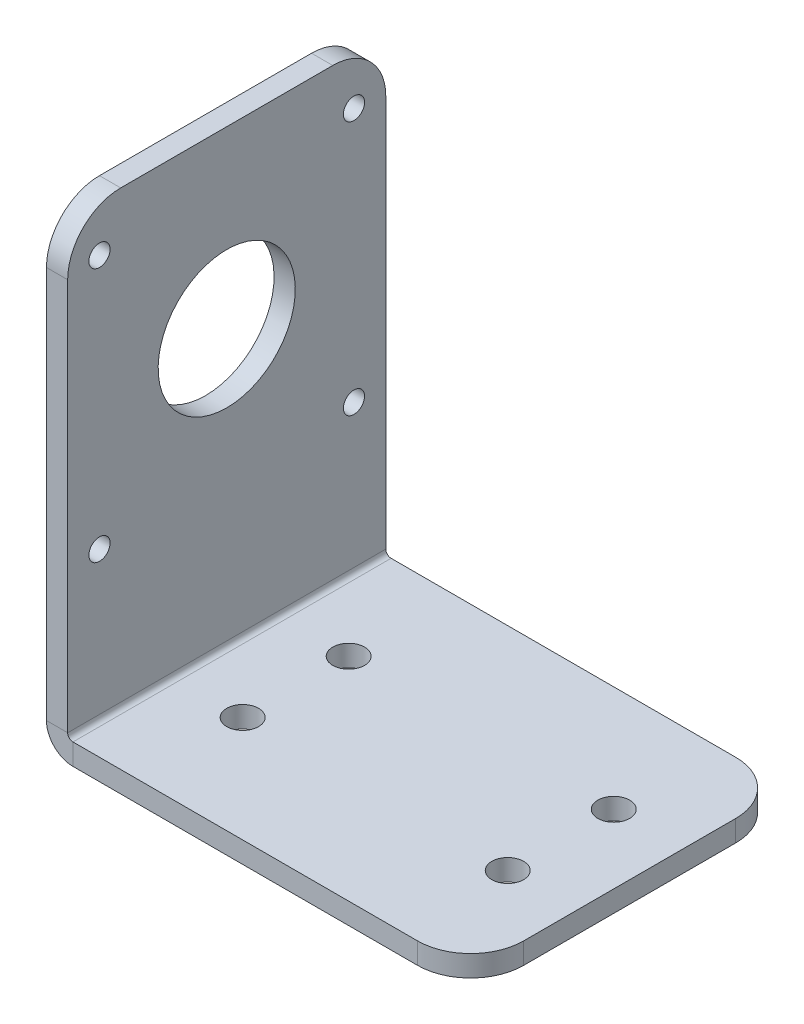
ISO-10303-21;
HEADER;
FILE_DESCRIPTION(('STEP AP214'),'2;1');
FILE_NAME('part.step','',(''),(''),'','','');
FILE_SCHEMA(('AUTOMOTIVE_DESIGN { 1 0 10303 214 1 1 1 1 }'));
ENDSEC;
DATA;
#1=APPLICATION_CONTEXT('core data for automotive mechanical design processes');
#2=APPLICATION_PROTOCOL_DEFINITION('international standard','automotive_design',2000,#1);
#3=PRODUCT_CONTEXT('',#1,'mechanical');
#4=PRODUCT('Part','Part','',(#3));
#5=PRODUCT_RELATED_PRODUCT_CATEGORY('part','',(#4));
#6=PRODUCT_DEFINITION_FORMATION('','',#4);
#7=PRODUCT_DEFINITION_CONTEXT('part definition',#1,'design');
#8=PRODUCT_DEFINITION('design','',#6,#7);
#9=PRODUCT_DEFINITION_SHAPE('','',#8);
#10=(LENGTH_UNIT() NAMED_UNIT(*) SI_UNIT(.MILLI.,.METRE.));
#11=(NAMED_UNIT(*) PLANE_ANGLE_UNIT() SI_UNIT($,.RADIAN.));
#12=(NAMED_UNIT(*) SI_UNIT($,.STERADIAN.) SOLID_ANGLE_UNIT());
#13=UNCERTAINTY_MEASURE_WITH_UNIT(LENGTH_MEASURE(1.E-05),#10,'distance_accuracy_value','');
#14=(GEOMETRIC_REPRESENTATION_CONTEXT(3) GLOBAL_UNCERTAINTY_ASSIGNED_CONTEXT((#13)) GLOBAL_UNIT_ASSIGNED_CONTEXT((#10,
#11,#12)) REPRESENTATION_CONTEXT('',''));
#15=CARTESIAN_POINT('',(0.,0.,0.));
#16=DIRECTION('',(0.,0.,1.));
#17=DIRECTION('',(1.,0.,0.));
#18=AXIS2_PLACEMENT_3D('',#15,#16,#17);
#19=CARTESIAN_POINT('',(18.75,-2.,-15.));
#20=DIRECTION('',(1.,0.,0.));
#21=DIRECTION('',(0.,0.,-1.));
#22=AXIS2_PLACEMENT_3D('',#19,#20,#21);
#23=PLANE('',#22);
#24=DIRECTION('',(0.,0.,-1.));
#25=VECTOR('',#24,1.);
#26=CARTESIAN_POINT('',(18.75,-2.,-15.));
#27=LINE('',#26,#25);
#28=CARTESIAN_POINT('',(18.75,-2.,10.));
#29=VERTEX_POINT('',#28);
#30=CARTESIAN_POINT('',(18.75,-2.,-10.));
#31=VERTEX_POINT('',#30);
#32=EDGE_CURVE('E201',#29,#31,#27,.T.);
#33=ORIENTED_EDGE('',*,*,#32,.T.);
#34=DIRECTION('',(0.,1.,0.));
#35=VECTOR('',#34,1.);
#36=CARTESIAN_POINT('',(18.75,-2.,-10.));
#37=LINE('',#36,#35);
#38=CARTESIAN_POINT('',(18.75,0.,-10.));
#39=VERTEX_POINT('',#38);
#40=EDGE_CURVE('E226',#31,#39,#37,.T.);
#41=ORIENTED_EDGE('',*,*,#40,.T.);
#42=DIRECTION('',(0.,0.,-1.));
#43=VECTOR('',#42,1.);
#44=CARTESIAN_POINT('',(18.75,0.,-15.));
#45=LINE('',#44,#43);
#46=CARTESIAN_POINT('',(18.75,0.,10.));
#47=VERTEX_POINT('',#46);
#48=EDGE_CURVE('E196',#47,#39,#45,.T.);
#49=ORIENTED_EDGE('',*,*,#48,.F.);
#50=DIRECTION('',(0.,1.,0.));
#51=VECTOR('',#50,1.);
#52=CARTESIAN_POINT('',(18.75,-2.,10.));
#53=LINE('',#52,#51);
#54=EDGE_CURVE('E222',#47,#29,#53,.F.);
#55=ORIENTED_EDGE('',*,*,#54,.T.);
#56=EDGE_LOOP('',(#33,#41,#49,#55));
#57=FACE_BOUND('',#56,.T.);
#58=ADVANCED_FACE('F56',(#57),#23,.T.);
#59=CARTESIAN_POINT('',(-18.75,-2.,15.));
#60=DIRECTION('',(0.,0.,1.));
#61=DIRECTION('',(1.,0.,0.));
#62=AXIS2_PLACEMENT_3D('',#59,#60,#61);
#63=PLANE('',#62);
#64=DIRECTION('',(1.,0.,0.));
#65=VECTOR('',#64,1.);
#66=CARTESIAN_POINT('',(-18.75,-2.,15.));
#67=LINE('',#66,#65);
#68=CARTESIAN_POINT('',(-18.75,-2.00000000000001,15.));
#69=VERTEX_POINT('',#68);
#70=CARTESIAN_POINT('',(13.75,-2.,15.));
#71=VERTEX_POINT('',#70);
#72=EDGE_CURVE('E208',#69,#71,#67,.T.);
#73=ORIENTED_EDGE('',*,*,#72,.T.);
#74=DIRECTION('',(0.,1.,0.));
#75=VECTOR('',#74,1.);
#76=CARTESIAN_POINT('',(13.75,-2.,15.));
#77=LINE('',#76,#75);
#78=CARTESIAN_POINT('',(13.75,0.,15.));
#79=VERTEX_POINT('',#78);
#80=EDGE_CURVE('E239',#71,#79,#77,.T.);
#81=ORIENTED_EDGE('',*,*,#80,.T.);
#82=DIRECTION('',(1.,0.,0.));
#83=VECTOR('',#82,1.);
#84=CARTESIAN_POINT('',(-18.75,0.,15.));
#85=LINE('',#84,#83);
#86=CARTESIAN_POINT('',(-18.75,0.,15.));
#87=VERTEX_POINT('',#86);
#88=EDGE_CURVE('E205',#87,#79,#85,.T.);
#89=ORIENTED_EDGE('',*,*,#88,.F.);
#90=DIRECTION('',(0.,1.,0.));
#91=VECTOR('',#90,1.);
#92=CARTESIAN_POINT('',(-18.75,-2.,15.));
#93=LINE('',#92,#91);
#94=EDGE_CURVE('E220',#69,#87,#93,.T.);
#95=ORIENTED_EDGE('',*,*,#94,.F.);
#96=EDGE_LOOP('',(#73,#81,#89,#95));
#97=FACE_BOUND('',#96,.T.);
#98=ADVANCED_FACE('F290',(#97),#63,.T.);
#99=CARTESIAN_POINT('',(-18.75,-2.,-15.));
#100=DIRECTION('',(0.,0.,-1.));
#101=DIRECTION('',(-1.,0.,0.));
#102=AXIS2_PLACEMENT_3D('',#99,#100,#101);
#103=PLANE('',#102);
#104=DIRECTION('',(-1.,0.,0.));
#105=VECTOR('',#104,1.);
#106=CARTESIAN_POINT('',(-18.75,0.,-15.));
#107=LINE('',#106,#105);
#108=CARTESIAN_POINT('',(13.75,0.,-15.));
#109=VERTEX_POINT('',#108);
#110=CARTESIAN_POINT('',(-18.75,0.,-15.));
#111=VERTEX_POINT('',#110);
#112=EDGE_CURVE('E214',#109,#111,#107,.T.);
#113=ORIENTED_EDGE('',*,*,#112,.F.);
#114=DIRECTION('',(0.,1.,0.));
#115=VECTOR('',#114,1.);
#116=CARTESIAN_POINT('',(13.75,-2.,-15.));
#117=LINE('',#116,#115);
#118=CARTESIAN_POINT('',(13.75,-2.,-15.));
#119=VERTEX_POINT('',#118);
#120=EDGE_CURVE('E233',#109,#119,#117,.F.);
#121=ORIENTED_EDGE('',*,*,#120,.T.);
#122=DIRECTION('',(-1.,0.,0.));
#123=VECTOR('',#122,1.);
#124=CARTESIAN_POINT('',(-18.75,-2.,-15.));
#125=LINE('',#124,#123);
#126=CARTESIAN_POINT('',(-18.75,-2.,-15.));
#127=VERTEX_POINT('',#126);
#128=EDGE_CURVE('E204',#119,#127,#125,.T.);
#129=ORIENTED_EDGE('',*,*,#128,.T.);
#130=DIRECTION('',(0.,1.,0.));
#131=VECTOR('',#130,1.);
#132=CARTESIAN_POINT('',(-18.75,-2.,-15.));
#133=LINE('',#132,#131);
#134=EDGE_CURVE('E211',#127,#111,#133,.T.);
#135=ORIENTED_EDGE('',*,*,#134,.T.);
#136=EDGE_LOOP('',(#113,#121,#129,#135));
#137=FACE_BOUND('',#136,.T.);
#138=ADVANCED_FACE('F278',(#137),#103,.T.);
#139=CARTESIAN_POINT('',(0.,-2.,0.));
#140=DIRECTION('',(0.,1.,0.));
#141=DIRECTION('',(0.,0.,1.));
#142=AXIS2_PLACEMENT_3D('',#139,#140,#141);
#143=PLANE('',#142);
#144=CARTESIAN_POINT('',(-12.75,-2.,-5.));
#145=DIRECTION('',(0.,-1.,0.));
#146=DIRECTION('',(0.,0.,-1.));
#147=AXIS2_PLACEMENT_3D('',#144,#145,#146);
#148=CIRCLE('',#147,1.5);
#149=CARTESIAN_POINT('',(-12.75,-2.,-6.5));
#150=VERTEX_POINT('',#149);
#151=EDGE_CURVE('E428',#150,#150,#148,.T.);
#152=ORIENTED_EDGE('',*,*,#151,.F.);
#153=EDGE_LOOP('',(#152));
#154=FACE_BOUND('',#153,.T.);
#155=CARTESIAN_POINT('',(12.25,-2.,-5.));
#156=DIRECTION('',(0.,-1.,0.));
#157=DIRECTION('',(0.,0.,-1.));
#158=AXIS2_PLACEMENT_3D('',#155,#156,#157);
#159=CIRCLE('',#158,1.5);
#160=CARTESIAN_POINT('',(12.25,-2.,-6.5));
#161=VERTEX_POINT('',#160);
#162=EDGE_CURVE('E422',#161,#161,#159,.T.);
#163=ORIENTED_EDGE('',*,*,#162,.F.);
#164=EDGE_LOOP('',(#163));
#165=FACE_BOUND('',#164,.T.);
#166=CARTESIAN_POINT('',(12.25,-2.,5.));
#167=DIRECTION('',(0.,-1.,0.));
#168=DIRECTION('',(0.,0.,-1.));
#169=AXIS2_PLACEMENT_3D('',#166,#167,#168);
#170=CIRCLE('',#169,1.5);
#171=CARTESIAN_POINT('',(12.25,-2.,3.5));
#172=VERTEX_POINT('',#171);
#173=EDGE_CURVE('E415',#172,#172,#170,.T.);
#174=ORIENTED_EDGE('',*,*,#173,.F.);
#175=EDGE_LOOP('',(#174));
#176=FACE_BOUND('',#175,.T.);
#177=CARTESIAN_POINT('',(-12.75,-2.,5.));
#178=DIRECTION('',(0.,-1.,0.));
#179=DIRECTION('',(0.,0.,-1.));
#180=AXIS2_PLACEMENT_3D('',#177,#178,#179);
#181=CIRCLE('',#180,1.5);
#182=CARTESIAN_POINT('',(-12.75,-2.,3.5));
#183=VERTEX_POINT('',#182);
#184=EDGE_CURVE('E418',#183,#183,#181,.T.);
#185=ORIENTED_EDGE('',*,*,#184,.F.);
#186=EDGE_LOOP('',(#185));
#187=FACE_BOUND('',#186,.T.);
#188=ORIENTED_EDGE('',*,*,#128,.F.);
#189=CARTESIAN_POINT('',(13.75,-2.,-10.));
#190=DIRECTION('',(0.,1.,0.));
#191=DIRECTION('',(0.,0.,1.));
#192=AXIS2_PLACEMENT_3D('',#189,#190,#191);
#193=CIRCLE('',#192,5.);
#194=EDGE_CURVE('E237',#119,#31,#193,.F.);
#195=ORIENTED_EDGE('',*,*,#194,.T.);
#196=ORIENTED_EDGE('',*,*,#32,.F.);
#197=CARTESIAN_POINT('',(13.75,-2.,10.));
#198=DIRECTION('',(0.,1.,0.));
#199=DIRECTION('',(0.,0.,1.));
#200=AXIS2_PLACEMENT_3D('',#197,#198,#199);
#201=CIRCLE('',#200,5.);
#202=EDGE_CURVE('E235',#29,#71,#201,.F.);
#203=ORIENTED_EDGE('',*,*,#202,.T.);
#204=ORIENTED_EDGE('',*,*,#72,.F.);
#205=DIRECTION('',(0.,0.,1.));
#206=VECTOR('',#205,1.);
#207=CARTESIAN_POINT('',(-18.75,-2.,-15.));
#208=LINE('',#207,#206);
#209=EDGE_CURVE('E157',#127,#69,#208,.T.);
#210=ORIENTED_EDGE('',*,*,#209,.F.);
#211=EDGE_LOOP('',(#188,#195,#196,#203,#204,#210));
#212=FACE_BOUND('',#211,.T.);
#213=ADVANCED_FACE('F283',(#154,#165,#176,#187,#212),#143,.F.);
#214=CARTESIAN_POINT('',(0.,0.,0.));
#215=DIRECTION('',(0.,1.,0.));
#216=DIRECTION('',(0.,0.,1.));
#217=AXIS2_PLACEMENT_3D('',#214,#215,#216);
#218=PLANE('',#217);
#219=CARTESIAN_POINT('',(-12.75,0.,-5.));
#220=DIRECTION('',(0.,-1.,0.));
#221=DIRECTION('',(0.,0.,-1.));
#222=AXIS2_PLACEMENT_3D('',#219,#220,#221);
#223=CIRCLE('',#222,1.5);
#224=CARTESIAN_POINT('',(-12.75,0.,-6.5));
#225=VERTEX_POINT('',#224);
#226=EDGE_CURVE('E412',#225,#225,#223,.T.);
#227=ORIENTED_EDGE('',*,*,#226,.T.);
#228=EDGE_LOOP('',(#227));
#229=FACE_BOUND('',#228,.T.);
#230=CARTESIAN_POINT('',(12.25,0.,-5.));
#231=DIRECTION('',(0.,-1.,0.));
#232=DIRECTION('',(0.,0.,-1.));
#233=AXIS2_PLACEMENT_3D('',#230,#231,#232);
#234=CIRCLE('',#233,1.5);
#235=CARTESIAN_POINT('',(12.25,0.,-6.5));
#236=VERTEX_POINT('',#235);
#237=EDGE_CURVE('E425',#236,#236,#234,.T.);
#238=ORIENTED_EDGE('',*,*,#237,.T.);
#239=EDGE_LOOP('',(#238));
#240=FACE_BOUND('',#239,.T.);
#241=CARTESIAN_POINT('',(12.25,0.,5.));
#242=DIRECTION('',(0.,-1.,0.));
#243=DIRECTION('',(0.,0.,-1.));
#244=AXIS2_PLACEMENT_3D('',#241,#242,#243);
#245=CIRCLE('',#244,1.5);
#246=CARTESIAN_POINT('',(12.25,0.,3.5));
#247=VERTEX_POINT('',#246);
#248=EDGE_CURVE('E419',#247,#247,#245,.T.);
#249=ORIENTED_EDGE('',*,*,#248,.T.);
#250=EDGE_LOOP('',(#249));
#251=FACE_BOUND('',#250,.T.);
#252=CARTESIAN_POINT('',(-12.75,0.,5.));
#253=DIRECTION('',(0.,-1.,0.));
#254=DIRECTION('',(0.,0.,-1.));
#255=AXIS2_PLACEMENT_3D('',#252,#253,#254);
#256=CIRCLE('',#255,1.5);
#257=CARTESIAN_POINT('',(-12.75,0.,3.5));
#258=VERTEX_POINT('',#257);
#259=EDGE_CURVE('E195',#258,#258,#256,.T.);
#260=ORIENTED_EDGE('',*,*,#259,.T.);
#261=EDGE_LOOP('',(#260));
#262=FACE_BOUND('',#261,.T.);
#263=ORIENTED_EDGE('',*,*,#48,.T.);
#264=CARTESIAN_POINT('',(13.75,0.,-10.));
#265=DIRECTION('',(0.,1.,0.));
#266=DIRECTION('',(0.,0.,1.));
#267=AXIS2_PLACEMENT_3D('',#264,#265,#266);
#268=CIRCLE('',#267,5.);
#269=EDGE_CURVE('E231',#39,#109,#268,.T.);
#270=ORIENTED_EDGE('',*,*,#269,.T.);
#271=ORIENTED_EDGE('',*,*,#112,.T.);
#272=DIRECTION('',(0.,0.,1.));
#273=VECTOR('',#272,1.);
#274=CARTESIAN_POINT('',(-18.75,0.,-15.));
#275=LINE('',#274,#273);
#276=EDGE_CURVE('E216',#111,#87,#275,.T.);
#277=ORIENTED_EDGE('',*,*,#276,.T.);
#278=ORIENTED_EDGE('',*,*,#88,.T.);
#279=CARTESIAN_POINT('',(13.75,0.,10.));
#280=DIRECTION('',(0.,1.,0.));
#281=DIRECTION('',(0.,0.,1.));
#282=AXIS2_PLACEMENT_3D('',#279,#280,#281);
#283=CIRCLE('',#282,5.);
#284=EDGE_CURVE('E229',#79,#47,#283,.T.);
#285=ORIENTED_EDGE('',*,*,#284,.T.);
#286=EDGE_LOOP('',(#263,#270,#271,#277,#278,#285));
#287=FACE_BOUND('',#286,.T.);
#288=ADVANCED_FACE('F292',(#229,#240,#251,#262,#287),#218,.T.);
#289=CARTESIAN_POINT('',(-18.75,0.499999999999999,-15.));
#290=DIRECTION('',(0.,0.,-1.));
#291=DIRECTION('',(0.,1.,0.));
#292=AXIS2_PLACEMENT_3D('',#289,#290,#291);
#293=PLANE('',#292);
#294=DIRECTION('',(1.,0.,0.));
#295=VECTOR('',#294,1.);
#296=CARTESIAN_POINT('',(-21.25,0.49999999999999,-15.));
#297=LINE('',#296,#295);
#298=CARTESIAN_POINT('',(-19.25,0.499999999999997,-15.));
#299=VERTEX_POINT('',#298);
#300=CARTESIAN_POINT('',(-21.25,0.49999999999999,-15.));
#301=VERTEX_POINT('',#300);
#302=EDGE_CURVE('E192',#299,#301,#297,.F.);
#303=ORIENTED_EDGE('',*,*,#302,.F.);
#304=CARTESIAN_POINT('',(-18.75,0.499999999999999,-15.));
#305=DIRECTION('',(0.,0.,1.));
#306=DIRECTION('',(0.,-1.,0.));
#307=AXIS2_PLACEMENT_3D('',#304,#305,#306);
#308=CIRCLE('',#307,0.500000000000004);
#309=EDGE_CURVE('E161',#111,#299,#308,.F.);
#310=ORIENTED_EDGE('',*,*,#309,.F.);
#311=ORIENTED_EDGE('',*,*,#134,.F.);
#312=CARTESIAN_POINT('',(-18.75,0.499999999999999,-15.));
#313=DIRECTION('',(0.,0.,1.));
#314=DIRECTION('',(0.,-1.,0.));
#315=AXIS2_PLACEMENT_3D('',#312,#313,#314);
#316=CIRCLE('',#315,2.5);
#317=EDGE_CURVE('E160',#127,#301,#316,.F.);
#318=ORIENTED_EDGE('',*,*,#317,.T.);
#319=EDGE_LOOP('',(#303,#310,#311,#318));
#320=FACE_BOUND('',#319,.T.);
#321=ADVANCED_FACE('F275',(#320),#293,.T.);
#322=CARTESIAN_POINT('',(-18.75,0.499999999999995,15.));
#323=DIRECTION('',(0.,0.,-1.));
#324=DIRECTION('',(0.,1.,0.));
#325=AXIS2_PLACEMENT_3D('',#322,#323,#324);
#326=PLANE('',#325);
#327=CARTESIAN_POINT('',(-18.75,0.499999999999995,15.));
#328=DIRECTION('',(0.,0.,1.));
#329=DIRECTION('',(0.,-1.,0.));
#330=AXIS2_PLACEMENT_3D('',#327,#328,#329);
#331=CIRCLE('',#330,0.500000000000004);
#332=CARTESIAN_POINT('',(-19.25,0.499999999999994,15.));
#333=VERTEX_POINT('',#332);
#334=EDGE_CURVE('E168',#333,#87,#331,.T.);
#335=ORIENTED_EDGE('',*,*,#334,.F.);
#336=DIRECTION('',(1.,0.,0.));
#337=VECTOR('',#336,1.);
#338=CARTESIAN_POINT('',(-19.25,0.499999999999994,15.));
#339=LINE('',#338,#337);
#340=CARTESIAN_POINT('',(-21.25,0.499999999999986,15.));
#341=VERTEX_POINT('',#340);
#342=EDGE_CURVE('E165',#333,#341,#339,.F.);
#343=ORIENTED_EDGE('',*,*,#342,.T.);
#344=CARTESIAN_POINT('',(-18.75,0.499999999999995,15.));
#345=DIRECTION('',(0.,0.,1.));
#346=DIRECTION('',(0.,-1.,0.));
#347=AXIS2_PLACEMENT_3D('',#344,#345,#346);
#348=CIRCLE('',#347,2.5);
#349=EDGE_CURVE('E149',#341,#69,#348,.T.);
#350=ORIENTED_EDGE('',*,*,#349,.T.);
#351=ORIENTED_EDGE('',*,*,#94,.T.);
#352=EDGE_LOOP('',(#335,#343,#350,#351));
#353=FACE_BOUND('',#352,.T.);
#354=ADVANCED_FACE('F166',(#353),#326,.F.);
#355=CARTESIAN_POINT('',(-18.75,0.499999999999995,15.));
#356=DIRECTION('',(0.,0.,1.));
#357=DIRECTION('',(-1.,0.,0.));
#358=AXIS2_PLACEMENT_3D('',#355,#356,#357);
#359=CYLINDRICAL_SURFACE('',#358,2.5);
#360=ORIENTED_EDGE('',*,*,#209,.T.);
#361=ORIENTED_EDGE('',*,*,#349,.F.);
#362=DIRECTION('',(0.,0.,1.));
#363=VECTOR('',#362,1.);
#364=CARTESIAN_POINT('',(-21.25,0.49999999999999,-15.));
#365=LINE('',#364,#363);
#366=EDGE_CURVE('E154',#341,#301,#365,.F.);
#367=ORIENTED_EDGE('',*,*,#366,.T.);
#368=ORIENTED_EDGE('',*,*,#317,.F.);
#369=EDGE_LOOP('',(#360,#361,#367,#368));
#370=FACE_BOUND('',#369,.T.);
#371=ADVANCED_FACE('F151',(#370),#359,.T.);
#372=CARTESIAN_POINT('',(-18.75,0.499999999999995,15.));
#373=DIRECTION('',(0.,0.,1.));
#374=DIRECTION('',(-1.,0.,0.));
#375=AXIS2_PLACEMENT_3D('',#372,#373,#374);
#376=CYLINDRICAL_SURFACE('',#375,0.500000000000004);
#377=ORIENTED_EDGE('',*,*,#276,.F.);
#378=ORIENTED_EDGE('',*,*,#309,.T.);
#379=DIRECTION('',(0.,0.,1.));
#380=VECTOR('',#379,1.);
#381=CARTESIAN_POINT('',(-19.25,0.499999999999997,-15.));
#382=LINE('',#381,#380);
#383=EDGE_CURVE('E170',#299,#333,#382,.T.);
#384=ORIENTED_EDGE('',*,*,#383,.T.);
#385=ORIENTED_EDGE('',*,*,#334,.T.);
#386=EDGE_LOOP('',(#377,#378,#384,#385));
#387=FACE_BOUND('',#386,.T.);
#388=ADVANCED_FACE('F271',(#387),#376,.F.);
#389=CARTESIAN_POINT('',(-21.25,0.,-15.));
#390=DIRECTION('',(0.,0.,1.));
#391=DIRECTION('',(1.,0.,0.));
#392=AXIS2_PLACEMENT_3D('',#389,#390,#391);
#393=PLANE('',#392);
#394=DIRECTION('',(0.,-1.,0.));
#395=VECTOR('',#394,1.);
#396=CARTESIAN_POINT('',(-21.25,0.,-15.));
#397=LINE('',#396,#395);
#398=CARTESIAN_POINT('',(-21.2500000000001,37.5,-15.));
#399=VERTEX_POINT('',#398);
#400=EDGE_CURVE('E175',#399,#301,#397,.T.);
#401=ORIENTED_EDGE('',*,*,#400,.F.);
#402=DIRECTION('',(1.,0.,0.));
#403=VECTOR('',#402,1.);
#404=CARTESIAN_POINT('',(-21.2500000000001,37.5,-15.));
#405=LINE('',#404,#403);
#406=CARTESIAN_POINT('',(-19.2500000000001,37.5,-15.));
#407=VERTEX_POINT('',#406);
#408=EDGE_CURVE('E13',#399,#407,#405,.T.);
#409=ORIENTED_EDGE('',*,*,#408,.T.);
#410=DIRECTION('',(0.,1.,0.));
#411=VECTOR('',#410,1.);
#412=CARTESIAN_POINT('',(-19.25,0.,-15.));
#413=LINE('',#412,#411);
#414=EDGE_CURVE('E176',#407,#299,#413,.F.);
#415=ORIENTED_EDGE('',*,*,#414,.T.);
#416=ORIENTED_EDGE('',*,*,#302,.T.);
#417=EDGE_LOOP('',(#401,#409,#415,#416));
#418=FACE_BOUND('',#417,.T.);
#419=ADVANCED_FACE('F267',(#418),#393,.F.);
#420=CARTESIAN_POINT('',(-21.2500000000001,42.5,15.));
#421=DIRECTION('',(0.,0.,-1.));
#422=DIRECTION('',(-1.,0.,0.));
#423=AXIS2_PLACEMENT_3D('',#420,#421,#422);
#424=PLANE('',#423);
#425=DIRECTION('',(0.,-1.,0.));
#426=VECTOR('',#425,1.);
#427=CARTESIAN_POINT('',(-19.2500000000001,42.5,15.));
#428=LINE('',#427,#426);
#429=CARTESIAN_POINT('',(-19.2500000000001,37.5,15.));
#430=VERTEX_POINT('',#429);
#431=EDGE_CURVE('E188',#333,#430,#428,.F.);
#432=ORIENTED_EDGE('',*,*,#431,.T.);
#433=DIRECTION('',(1.,0.,0.));
#434=VECTOR('',#433,1.);
#435=CARTESIAN_POINT('',(-21.2500000000001,37.5,15.));
#436=LINE('',#435,#434);
#437=CARTESIAN_POINT('',(-21.2500000000001,37.5,15.));
#438=VERTEX_POINT('',#437);
#439=EDGE_CURVE('E79',#430,#438,#436,.F.);
#440=ORIENTED_EDGE('',*,*,#439,.T.);
#441=DIRECTION('',(0.,1.,0.));
#442=VECTOR('',#441,1.);
#443=CARTESIAN_POINT('',(-21.25,0.,15.));
#444=LINE('',#443,#442);
#445=EDGE_CURVE('E173',#341,#438,#444,.T.);
#446=ORIENTED_EDGE('',*,*,#445,.F.);
#447=ORIENTED_EDGE('',*,*,#342,.F.);
#448=EDGE_LOOP('',(#432,#440,#446,#447));
#449=FACE_BOUND('',#448,.T.);
#450=ADVANCED_FACE('F178',(#449),#424,.F.);
#451=CARTESIAN_POINT('',(-21.25,0.,0.));
#452=DIRECTION('',(1.,0.,0.));
#453=DIRECTION('',(0.,1.,0.));
#454=AXIS2_PLACEMENT_3D('',#451,#452,#453);
#455=PLANE('',#454);
#456=CARTESIAN_POINT('',(-21.25,14.,-12.));
#457=DIRECTION('',(-1.,0.,0.));
#458=DIRECTION('',(0.,-1.,0.));
#459=AXIS2_PLACEMENT_3D('',#456,#457,#458);
#460=CIRCLE('',#459,0.999999999999999);
#461=CARTESIAN_POINT('',(-21.25,13.,-12.));
#462=VERTEX_POINT('',#461);
#463=EDGE_CURVE('E406',#462,#462,#460,.T.);
#464=ORIENTED_EDGE('',*,*,#463,.F.);
#465=EDGE_LOOP('',(#464));
#466=FACE_BOUND('',#465,.T.);
#467=CARTESIAN_POINT('',(-21.25,14.,12.));
#468=DIRECTION('',(-1.,0.,0.));
#469=DIRECTION('',(0.,-1.,0.));
#470=AXIS2_PLACEMENT_3D('',#467,#468,#469);
#471=CIRCLE('',#470,0.999999999999999);
#472=CARTESIAN_POINT('',(-21.25,13.,12.));
#473=VERTEX_POINT('',#472);
#474=EDGE_CURVE('E400',#473,#473,#471,.T.);
#475=ORIENTED_EDGE('',*,*,#474,.F.);
#476=EDGE_LOOP('',(#475));
#477=FACE_BOUND('',#476,.T.);
#478=CARTESIAN_POINT('',(-21.2500000000001,38.,12.));
#479=DIRECTION('',(-1.,0.,0.));
#480=DIRECTION('',(0.,-1.,0.));
#481=AXIS2_PLACEMENT_3D('',#478,#479,#480);
#482=CIRCLE('',#481,1.);
#483=CARTESIAN_POINT('',(-21.2500000000001,37.,12.));
#484=VERTEX_POINT('',#483);
#485=EDGE_CURVE('E392',#484,#484,#482,.T.);
#486=ORIENTED_EDGE('',*,*,#485,.F.);
#487=EDGE_LOOP('',(#486));
#488=FACE_BOUND('',#487,.T.);
#489=CARTESIAN_POINT('',(-21.2500000000001,38.,-12.));
#490=DIRECTION('',(-1.,0.,0.));
#491=DIRECTION('',(0.,-1.,0.));
#492=AXIS2_PLACEMENT_3D('',#489,#490,#491);
#493=CIRCLE('',#492,1.);
#494=CARTESIAN_POINT('',(-21.2500000000001,37.,-12.));
#495=VERTEX_POINT('',#494);
#496=EDGE_CURVE('E385',#495,#495,#493,.T.);
#497=ORIENTED_EDGE('',*,*,#496,.F.);
#498=EDGE_LOOP('',(#497));
#499=FACE_BOUND('',#498,.T.);
#500=CARTESIAN_POINT('',(-21.2500000000001,26.,0.));
#501=DIRECTION('',(-1.,0.,0.));
#502=DIRECTION('',(0.,-1.,0.));
#503=AXIS2_PLACEMENT_3D('',#500,#501,#502);
#504=CIRCLE('',#503,6.46612037113907);
#505=CARTESIAN_POINT('',(-21.2500000000001,19.5338796288609,0.));
#506=VERTEX_POINT('',#505);
#507=EDGE_CURVE('E389',#506,#506,#504,.T.);
#508=ORIENTED_EDGE('',*,*,#507,.F.);
#509=EDGE_LOOP('',(#508));
#510=FACE_BOUND('',#509,.T.);
#511=ORIENTED_EDGE('',*,*,#445,.T.);
#512=CARTESIAN_POINT('',(-21.2500000000001,37.5,10.));
#513=DIRECTION('',(1.,0.,0.));
#514=DIRECTION('',(0.,1.,0.));
#515=AXIS2_PLACEMENT_3D('',#512,#513,#514);
#516=CIRCLE('',#515,5.);
#517=CARTESIAN_POINT('',(-21.2500000000001,42.5,10.));
#518=VERTEX_POINT('',#517);
#519=EDGE_CURVE('E64',#438,#518,#516,.F.);
#520=ORIENTED_EDGE('',*,*,#519,.T.);
#521=DIRECTION('',(0.,0.,-1.));
#522=VECTOR('',#521,1.);
#523=CARTESIAN_POINT('',(-21.2500000000001,42.5,0.));
#524=LINE('',#523,#522);
#525=CARTESIAN_POINT('',(-21.2500000000001,42.5,-10.));
#526=VERTEX_POINT('',#525);
#527=EDGE_CURVE('E179',#518,#526,#524,.T.);
#528=ORIENTED_EDGE('',*,*,#527,.T.);
#529=CARTESIAN_POINT('',(-21.2500000000001,37.5,-10.));
#530=DIRECTION('',(1.,0.,0.));
#531=DIRECTION('',(0.,1.,0.));
#532=AXIS2_PLACEMENT_3D('',#529,#530,#531);
#533=CIRCLE('',#532,5.);
#534=EDGE_CURVE('E71',#526,#399,#533,.F.);
#535=ORIENTED_EDGE('',*,*,#534,.T.);
#536=ORIENTED_EDGE('',*,*,#400,.T.);
#537=ORIENTED_EDGE('',*,*,#366,.F.);
#538=EDGE_LOOP('',(#511,#520,#528,#535,#536,#537));
#539=FACE_BOUND('',#538,.T.);
#540=ADVANCED_FACE('F172',(#466,#477,#488,#499,#510,#539),#455,.F.);
#541=CARTESIAN_POINT('',(-19.25,0.,0.));
#542=DIRECTION('',(1.,0.,0.));
#543=DIRECTION('',(0.,1.,0.));
#544=AXIS2_PLACEMENT_3D('',#541,#542,#543);
#545=PLANE('',#544);
#546=CARTESIAN_POINT('',(-19.25,14.,-12.));
#547=DIRECTION('',(-1.,0.,0.));
#548=DIRECTION('',(0.,-1.,0.));
#549=AXIS2_PLACEMENT_3D('',#546,#547,#548);
#550=CIRCLE('',#549,0.999999999999999);
#551=CARTESIAN_POINT('',(-19.25,13.,-12.));
#552=VERTEX_POINT('',#551);
#553=EDGE_CURVE('E403',#552,#552,#550,.T.);
#554=ORIENTED_EDGE('',*,*,#553,.T.);
#555=EDGE_LOOP('',(#554));
#556=FACE_BOUND('',#555,.T.);
#557=CARTESIAN_POINT('',(-19.25,14.,12.));
#558=DIRECTION('',(-1.,0.,0.));
#559=DIRECTION('',(0.,-1.,0.));
#560=AXIS2_PLACEMENT_3D('',#557,#558,#559);
#561=CIRCLE('',#560,0.999999999999999);
#562=CARTESIAN_POINT('',(-19.25,13.,12.));
#563=VERTEX_POINT('',#562);
#564=EDGE_CURVE('E397',#563,#563,#561,.T.);
#565=ORIENTED_EDGE('',*,*,#564,.T.);
#566=EDGE_LOOP('',(#565));
#567=FACE_BOUND('',#566,.T.);
#568=CARTESIAN_POINT('',(-19.2500000000001,38.,12.));
#569=DIRECTION('',(-1.,0.,0.));
#570=DIRECTION('',(0.,-1.,0.));
#571=AXIS2_PLACEMENT_3D('',#568,#569,#570);
#572=CIRCLE('',#571,1.);
#573=CARTESIAN_POINT('',(-19.2500000000001,37.,12.));
#574=VERTEX_POINT('',#573);
#575=EDGE_CURVE('E387',#574,#574,#572,.T.);
#576=ORIENTED_EDGE('',*,*,#575,.T.);
#577=EDGE_LOOP('',(#576));
#578=FACE_BOUND('',#577,.T.);
#579=CARTESIAN_POINT('',(-19.2500000000001,38.,-12.));
#580=DIRECTION('',(-1.,0.,0.));
#581=DIRECTION('',(0.,-1.,0.));
#582=AXIS2_PLACEMENT_3D('',#579,#580,#581);
#583=CIRCLE('',#582,1.);
#584=CARTESIAN_POINT('',(-19.2500000000001,37.,-12.));
#585=VERTEX_POINT('',#584);
#586=EDGE_CURVE('E382',#585,#585,#583,.T.);
#587=ORIENTED_EDGE('',*,*,#586,.T.);
#588=EDGE_LOOP('',(#587));
#589=FACE_BOUND('',#588,.T.);
#590=CARTESIAN_POINT('',(-19.2500000000001,26.,0.));
#591=DIRECTION('',(-1.,0.,0.));
#592=DIRECTION('',(0.,-1.,0.));
#593=AXIS2_PLACEMENT_3D('',#590,#591,#592);
#594=CIRCLE('',#593,6.46612037113907);
#595=CARTESIAN_POINT('',(-19.2500000000001,19.5338796288609,0.));
#596=VERTEX_POINT('',#595);
#597=EDGE_CURVE('E409',#596,#596,#594,.T.);
#598=ORIENTED_EDGE('',*,*,#597,.T.);
#599=EDGE_LOOP('',(#598));
#600=FACE_BOUND('',#599,.T.);
#601=DIRECTION('',(0.,0.,1.));
#602=VECTOR('',#601,1.);
#603=CARTESIAN_POINT('',(-19.2500000000001,42.5,-15.));
#604=LINE('',#603,#602);
#605=CARTESIAN_POINT('',(-19.2500000000001,42.5,10.));
#606=VERTEX_POINT('',#605);
#607=CARTESIAN_POINT('',(-19.2500000000001,42.5,-10.));
#608=VERTEX_POINT('',#607);
#609=EDGE_CURVE('E182',#606,#608,#604,.F.);
#610=ORIENTED_EDGE('',*,*,#609,.F.);
#611=CARTESIAN_POINT('',(-19.2500000000001,37.5,10.));
#612=DIRECTION('',(1.,0.,0.));
#613=DIRECTION('',(0.,1.,0.));
#614=AXIS2_PLACEMENT_3D('',#611,#612,#613);
#615=CIRCLE('',#614,5.);
#616=EDGE_CURVE('E249',#606,#430,#615,.T.);
#617=ORIENTED_EDGE('',*,*,#616,.T.);
#618=ORIENTED_EDGE('',*,*,#431,.F.);
#619=ORIENTED_EDGE('',*,*,#383,.F.);
#620=ORIENTED_EDGE('',*,*,#414,.F.);
#621=CARTESIAN_POINT('',(-19.2500000000001,37.5,-10.));
#622=DIRECTION('',(1.,0.,0.));
#623=DIRECTION('',(0.,1.,0.));
#624=AXIS2_PLACEMENT_3D('',#621,#622,#623);
#625=CIRCLE('',#624,5.);
#626=EDGE_CURVE('E247',#407,#608,#625,.T.);
#627=ORIENTED_EDGE('',*,*,#626,.T.);
#628=EDGE_LOOP('',(#610,#617,#618,#619,#620,#627));
#629=FACE_BOUND('',#628,.T.);
#630=ADVANCED_FACE('F261',(#556,#567,#578,#589,#600,#629),#545,.T.);
#631=CARTESIAN_POINT('',(-21.2500000000001,42.5,-15.));
#632=DIRECTION('',(0.,-1.,0.));
#633=DIRECTION('',(1.,0.,0.));
#634=AXIS2_PLACEMENT_3D('',#631,#632,#633);
#635=PLANE('',#634);
#636=ORIENTED_EDGE('',*,*,#527,.F.);
#637=DIRECTION('',(1.,0.,0.));
#638=VECTOR('',#637,1.);
#639=CARTESIAN_POINT('',(-21.2500000000001,42.5,10.));
#640=LINE('',#639,#638);
#641=EDGE_CURVE('E244',#518,#606,#640,.T.);
#642=ORIENTED_EDGE('',*,*,#641,.T.);
#643=ORIENTED_EDGE('',*,*,#609,.T.);
#644=DIRECTION('',(1.,0.,0.));
#645=VECTOR('',#644,1.);
#646=CARTESIAN_POINT('',(-21.2500000000001,42.5,-10.));
#647=LINE('',#646,#645);
#648=EDGE_CURVE('E242',#608,#526,#647,.F.);
#649=ORIENTED_EDGE('',*,*,#648,.T.);
#650=EDGE_LOOP('',(#636,#642,#643,#649));
#651=FACE_BOUND('',#650,.T.);
#652=ADVANCED_FACE('F256',(#651),#635,.F.);
#653=CARTESIAN_POINT('',(-12.75,0.,5.));
#654=DIRECTION('',(0.,-1.,0.));
#655=DIRECTION('',(0.,0.,-1.));
#656=AXIS2_PLACEMENT_3D('',#653,#654,#655);
#657=CYLINDRICAL_SURFACE('',#656,1.5);
#658=ORIENTED_EDGE('',*,*,#259,.F.);
#659=EDGE_LOOP('',(#658));
#660=FACE_BOUND('',#659,.T.);
#661=ORIENTED_EDGE('',*,*,#184,.T.);
#662=EDGE_LOOP('',(#661));
#663=FACE_BOUND('',#662,.T.);
#664=ADVANCED_FACE('F342',(#660,#663),#657,.F.);
#665=CARTESIAN_POINT('',(12.25,0.,5.));
#666=DIRECTION('',(0.,-1.,0.));
#667=DIRECTION('',(0.,0.,-1.));
#668=AXIS2_PLACEMENT_3D('',#665,#666,#667);
#669=CYLINDRICAL_SURFACE('',#668,1.5);
#670=ORIENTED_EDGE('',*,*,#248,.F.);
#671=EDGE_LOOP('',(#670));
#672=FACE_BOUND('',#671,.T.);
#673=ORIENTED_EDGE('',*,*,#173,.T.);
#674=EDGE_LOOP('',(#673));
#675=FACE_BOUND('',#674,.T.);
#676=ADVANCED_FACE('F351',(#672,#675),#669,.F.);
#677=CARTESIAN_POINT('',(12.25,0.,-5.));
#678=DIRECTION('',(0.,-1.,0.));
#679=DIRECTION('',(0.,0.,-1.));
#680=AXIS2_PLACEMENT_3D('',#677,#678,#679);
#681=CYLINDRICAL_SURFACE('',#680,1.5);
#682=ORIENTED_EDGE('',*,*,#237,.F.);
#683=EDGE_LOOP('',(#682));
#684=FACE_BOUND('',#683,.T.);
#685=ORIENTED_EDGE('',*,*,#162,.T.);
#686=EDGE_LOOP('',(#685));
#687=FACE_BOUND('',#686,.T.);
#688=ADVANCED_FACE('F355',(#684,#687),#681,.F.);
#689=CARTESIAN_POINT('',(-12.75,0.,-5.));
#690=DIRECTION('',(0.,-1.,0.));
#691=DIRECTION('',(0.,0.,-1.));
#692=AXIS2_PLACEMENT_3D('',#689,#690,#691);
#693=CYLINDRICAL_SURFACE('',#692,1.5);
#694=ORIENTED_EDGE('',*,*,#226,.F.);
#695=EDGE_LOOP('',(#694));
#696=FACE_BOUND('',#695,.T.);
#697=ORIENTED_EDGE('',*,*,#151,.T.);
#698=EDGE_LOOP('',(#697));
#699=FACE_BOUND('',#698,.T.);
#700=ADVANCED_FACE('F311',(#696,#699),#693,.F.);
#701=CARTESIAN_POINT('',(13.75,-2.,-10.));
#702=DIRECTION('',(0.,1.,0.));
#703=DIRECTION('',(0.,0.,1.));
#704=AXIS2_PLACEMENT_3D('',#701,#702,#703);
#705=CYLINDRICAL_SURFACE('',#704,5.);
#706=ORIENTED_EDGE('',*,*,#194,.F.);
#707=ORIENTED_EDGE('',*,*,#120,.F.);
#708=ORIENTED_EDGE('',*,*,#269,.F.);
#709=ORIENTED_EDGE('',*,*,#40,.F.);
#710=EDGE_LOOP('',(#706,#707,#708,#709));
#711=FACE_BOUND('',#710,.T.);
#712=ADVANCED_FACE('F296',(#711),#705,.T.);
#713=CARTESIAN_POINT('',(13.75,-2.,10.));
#714=DIRECTION('',(0.,1.,0.));
#715=DIRECTION('',(0.,0.,1.));
#716=AXIS2_PLACEMENT_3D('',#713,#714,#715);
#717=CYLINDRICAL_SURFACE('',#716,5.);
#718=ORIENTED_EDGE('',*,*,#202,.F.);
#719=ORIENTED_EDGE('',*,*,#54,.F.);
#720=ORIENTED_EDGE('',*,*,#284,.F.);
#721=ORIENTED_EDGE('',*,*,#80,.F.);
#722=EDGE_LOOP('',(#718,#719,#720,#721));
#723=FACE_BOUND('',#722,.T.);
#724=ADVANCED_FACE('F300',(#723),#717,.T.);
#725=CARTESIAN_POINT('',(-19.2500000000001,26.,0.));
#726=DIRECTION('',(-1.,0.,0.));
#727=DIRECTION('',(0.,-1.,0.));
#728=AXIS2_PLACEMENT_3D('',#725,#726,#727);
#729=CYLINDRICAL_SURFACE('',#728,6.46612037113907);
#730=ORIENTED_EDGE('',*,*,#597,.F.);
#731=EDGE_LOOP('',(#730));
#732=FACE_BOUND('',#731,.T.);
#733=ORIENTED_EDGE('',*,*,#507,.T.);
#734=EDGE_LOOP('',(#733));
#735=FACE_BOUND('',#734,.T.);
#736=ADVANCED_FACE('F302',(#732,#735),#729,.F.);
#737=CARTESIAN_POINT('',(-19.2500000000001,38.,-12.));
#738=DIRECTION('',(-1.,0.,0.));
#739=DIRECTION('',(0.,-1.,0.));
#740=AXIS2_PLACEMENT_3D('',#737,#738,#739);
#741=CYLINDRICAL_SURFACE('',#740,1.);
#742=ORIENTED_EDGE('',*,*,#586,.F.);
#743=EDGE_LOOP('',(#742));
#744=FACE_BOUND('',#743,.T.);
#745=ORIENTED_EDGE('',*,*,#496,.T.);
#746=EDGE_LOOP('',(#745));
#747=FACE_BOUND('',#746,.T.);
#748=ADVANCED_FACE('F308',(#744,#747),#741,.F.);
#749=CARTESIAN_POINT('',(-19.2500000000001,38.,12.));
#750=DIRECTION('',(-1.,0.,0.));
#751=DIRECTION('',(0.,-1.,0.));
#752=AXIS2_PLACEMENT_3D('',#749,#750,#751);
#753=CYLINDRICAL_SURFACE('',#752,1.);
#754=ORIENTED_EDGE('',*,*,#575,.F.);
#755=EDGE_LOOP('',(#754));
#756=FACE_BOUND('',#755,.T.);
#757=ORIENTED_EDGE('',*,*,#485,.T.);
#758=EDGE_LOOP('',(#757));
#759=FACE_BOUND('',#758,.T.);
#760=ADVANCED_FACE('F370',(#756,#759),#753,.F.);
#761=CARTESIAN_POINT('',(-19.25,14.,12.));
#762=DIRECTION('',(-1.,0.,0.));
#763=DIRECTION('',(0.,-1.,0.));
#764=AXIS2_PLACEMENT_3D('',#761,#762,#763);
#765=CYLINDRICAL_SURFACE('',#764,0.999999999999999);
#766=ORIENTED_EDGE('',*,*,#564,.F.);
#767=EDGE_LOOP('',(#766));
#768=FACE_BOUND('',#767,.T.);
#769=ORIENTED_EDGE('',*,*,#474,.T.);
#770=EDGE_LOOP('',(#769));
#771=FACE_BOUND('',#770,.T.);
#772=ADVANCED_FACE('F366',(#768,#771),#765,.F.);
#773=CARTESIAN_POINT('',(-19.25,14.,-12.));
#774=DIRECTION('',(-1.,0.,0.));
#775=DIRECTION('',(0.,-1.,0.));
#776=AXIS2_PLACEMENT_3D('',#773,#774,#775);
#777=CYLINDRICAL_SURFACE('',#776,0.999999999999999);
#778=ORIENTED_EDGE('',*,*,#553,.F.);
#779=EDGE_LOOP('',(#778));
#780=FACE_BOUND('',#779,.T.);
#781=ORIENTED_EDGE('',*,*,#463,.T.);
#782=EDGE_LOOP('',(#781));
#783=FACE_BOUND('',#782,.T.);
#784=ADVANCED_FACE('F363',(#780,#783),#777,.F.);
#785=CARTESIAN_POINT('',(-21.2500000000001,37.5,10.));
#786=DIRECTION('',(1.,0.,0.));
#787=DIRECTION('',(0.,1.,0.));
#788=AXIS2_PLACEMENT_3D('',#785,#786,#787);
#789=CYLINDRICAL_SURFACE('',#788,5.);
#790=ORIENTED_EDGE('',*,*,#519,.F.);
#791=ORIENTED_EDGE('',*,*,#439,.F.);
#792=ORIENTED_EDGE('',*,*,#616,.F.);
#793=ORIENTED_EDGE('',*,*,#641,.F.);
#794=EDGE_LOOP('',(#790,#791,#792,#793));
#795=FACE_BOUND('',#794,.T.);
#796=ADVANCED_FACE('F259',(#795),#789,.T.);
#797=CARTESIAN_POINT('',(-21.2500000000001,37.5,-10.));
#798=DIRECTION('',(1.,0.,0.));
#799=DIRECTION('',(0.,1.,0.));
#800=AXIS2_PLACEMENT_3D('',#797,#798,#799);
#801=CYLINDRICAL_SURFACE('',#800,5.);
#802=ORIENTED_EDGE('',*,*,#534,.F.);
#803=ORIENTED_EDGE('',*,*,#648,.F.);
#804=ORIENTED_EDGE('',*,*,#626,.F.);
#805=ORIENTED_EDGE('',*,*,#408,.F.);
#806=EDGE_LOOP('',(#802,#803,#804,#805));
#807=FACE_BOUND('',#806,.T.);
#808=ADVANCED_FACE('F58',(#807),#801,.T.);
#809=CLOSED_SHELL('',(#58,#98,#138,#213,#288,#321,#354,#371,#388,#419,#450,#540,#630,#652,#664,
#676,#688,#700,#712,#724,#736,#748,#760,#772,#784,#796,#808));
#810=MANIFOLD_SOLID_BREP('B2',#809);
#811=ADVANCED_BREP_SHAPE_REPRESENTATION('',(#18,#810),#14);
#812=SHAPE_DEFINITION_REPRESENTATION(#9,#811);
ENDSEC;
END-ISO-10303-21;
